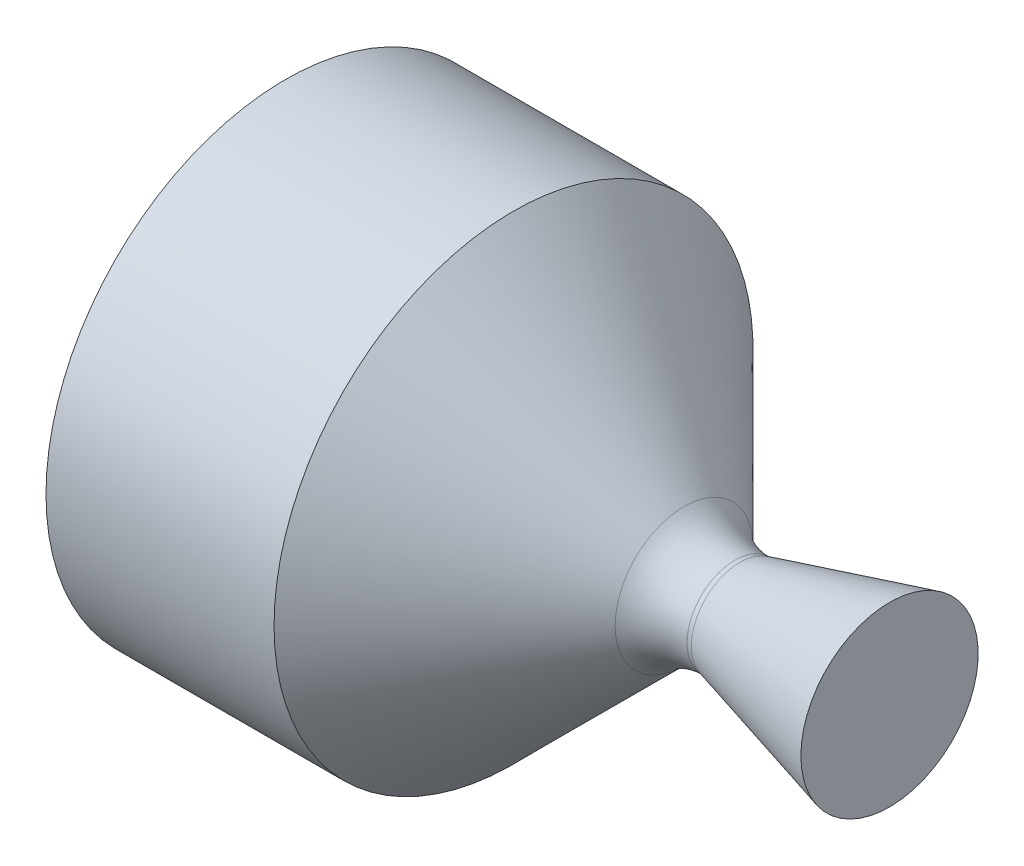
ISO-10303-21;
HEADER;
FILE_DESCRIPTION(('STEP AP214'),'2;1');
FILE_NAME('part.step','',(''),(''),'','','');
FILE_SCHEMA(('AUTOMOTIVE_DESIGN { 1 0 10303 214 1 1 1 1 }'));
ENDSEC;
DATA;
#1=APPLICATION_CONTEXT('core data for automotive mechanical design processes');
#2=APPLICATION_PROTOCOL_DEFINITION('international standard','automotive_design',2000,#1);
#3=PRODUCT_CONTEXT('',#1,'mechanical');
#4=PRODUCT('Part','Part','',(#3));
#5=PRODUCT_RELATED_PRODUCT_CATEGORY('part','',(#4));
#6=PRODUCT_DEFINITION_FORMATION('','',#4);
#7=PRODUCT_DEFINITION_CONTEXT('part definition',#1,'design');
#8=PRODUCT_DEFINITION('design','',#6,#7);
#9=PRODUCT_DEFINITION_SHAPE('','',#8);
#10=(LENGTH_UNIT() NAMED_UNIT(*) SI_UNIT(.MILLI.,.METRE.));
#11=(NAMED_UNIT(*) PLANE_ANGLE_UNIT() SI_UNIT($,.RADIAN.));
#12=(NAMED_UNIT(*) SI_UNIT($,.STERADIAN.) SOLID_ANGLE_UNIT());
#13=UNCERTAINTY_MEASURE_WITH_UNIT(LENGTH_MEASURE(1.E-05),#10,'distance_accuracy_value','');
#14=(GEOMETRIC_REPRESENTATION_CONTEXT(3) GLOBAL_UNCERTAINTY_ASSIGNED_CONTEXT((#13)) GLOBAL_UNIT_ASSIGNED_CONTEXT((#10,
#11,#12)) REPRESENTATION_CONTEXT('',''));
#15=CARTESIAN_POINT('',(0.,0.,0.));
#16=DIRECTION('',(0.,0.,1.));
#17=DIRECTION('',(1.,0.,0.));
#18=AXIS2_PLACEMENT_3D('',#15,#16,#17);
#19=CARTESIAN_POINT('',(-13.36065,28.0607,0.));
#20=DIRECTION('',(1.,0.,0.));
#21=DIRECTION('',(0.,0.,-1.));
#22=AXIS2_PLACEMENT_3D('',#19,#20,#21);
#23=PLANE('',#22);
#24=CARTESIAN_POINT('',(-13.36065,0.,0.));
#25=DIRECTION('',(-1.,0.,0.));
#26=DIRECTION('',(0.,0.,1.));
#27=AXIS2_PLACEMENT_3D('',#24,#25,#26);
#28=CIRCLE('',#27,28.0607);
#29=CARTESIAN_POINT('',(-13.36065,0.,28.0607));
#30=VERTEX_POINT('',#29);
#31=EDGE_CURVE('E61',#30,#30,#28,.T.);
#32=ORIENTED_EDGE('',*,*,#31,.T.);
#33=EDGE_LOOP('',(#32));
#34=FACE_BOUND('',#33,.T.);
#35=ADVANCED_FACE('F39',(#34),#23,.F.);
#36=CARTESIAN_POINT('',(57.4196308633517,10.3864,0.));
#37=DIRECTION('',(-1.,0.,0.));
#38=DIRECTION('',(0.,0.,1.));
#39=AXIS2_PLACEMENT_3D('',#36,#37,#38);
#40=PLANE('',#39);
#41=CARTESIAN_POINT('',(57.4196308633517,0.,0.));
#42=DIRECTION('',(-1.,0.,0.));
#43=DIRECTION('',(0.,0.,1.));
#44=AXIS2_PLACEMENT_3D('',#41,#42,#43);
#45=CIRCLE('',#44,10.3864);
#46=CARTESIAN_POINT('',(57.4196308633517,0.,10.3864));
#47=VERTEX_POINT('',#46);
#48=EDGE_CURVE('E10',#47,#47,#45,.T.);
#49=ORIENTED_EDGE('',*,*,#48,.F.);
#50=EDGE_LOOP('',(#49));
#51=FACE_BOUND('',#50,.T.);
#52=ADVANCED_FACE('F99',(#51),#40,.F.);
#53=CARTESIAN_POINT('',(57.4196308633517,0.,0.));
#54=DIRECTION('',(1.,0.,0.));
#55=DIRECTION('',(0.,0.,-1.));
#56=AXIS2_PLACEMENT_3D('',#53,#54,#55);
#57=CONICAL_SURFACE('',#56,10.3864,0.26179938779915);
#58=CARTESIAN_POINT('',(39.8871692452996,0.,0.));
#59=DIRECTION('',(-1.,0.,0.));
#60=DIRECTION('',(0.,0.,1.));
#61=AXIS2_PLACEMENT_3D('',#58,#59,#60);
#62=CIRCLE('',#61,5.68859106811325);
#63=CARTESIAN_POINT('',(39.8871692452996,0.,5.68859106811325));
#64=VERTEX_POINT('',#63);
#65=EDGE_CURVE('E44',#64,#64,#62,.T.);
#66=ORIENTED_EDGE('',*,*,#65,.F.);
#67=EDGE_LOOP('',(#66));
#68=FACE_BOUND('',#67,.T.);
#69=ORIENTED_EDGE('',*,*,#48,.T.);
#70=EDGE_LOOP('',(#69));
#71=FACE_BOUND('',#70,.T.);
#72=ADVANCED_FACE('F92',(#68,#71),#57,.T.);
#73=CARTESIAN_POINT('',(39.3061619000916,0.,0.));
#74=DIRECTION('',(-1.,0.,0.));
#75=DIRECTION('',(0.,0.,1.));
#76=AXIS2_PLACEMENT_3D('',#73,#74,#75);
#77=TOROIDAL_SURFACE('',#76,7.85694,2.24484);
#78=CARTESIAN_POINT('',(39.3061619000916,0.,0.));
#79=DIRECTION('',(-1.,0.,0.));
#80=DIRECTION('',(0.,0.,1.));
#81=AXIS2_PLACEMENT_3D('',#78,#79,#80);
#82=CIRCLE('',#81,5.6121);
#83=CARTESIAN_POINT('',(39.3061619000916,0.,5.6121));
#84=VERTEX_POINT('',#83);
#85=EDGE_CURVE('E47',#84,#84,#82,.T.);
#86=ORIENTED_EDGE('',*,*,#85,.F.);
#87=EDGE_LOOP('',(#86));
#88=FACE_BOUND('',#87,.T.);
#89=ORIENTED_EDGE('',*,*,#65,.T.);
#90=EDGE_LOOP('',(#89));
#91=FACE_BOUND('',#90,.T.);
#92=ADVANCED_FACE('F89',(#88,#91),#77,.F.);
#93=CARTESIAN_POINT('',(0.,0.,0.));
#94=DIRECTION('',(-1.,0.,0.));
#95=DIRECTION('',(0.,0.,1.));
#96=AXIS2_PLACEMENT_3D('',#93,#94,#95);
#97=CYLINDRICAL_SURFACE('',#96,5.6121);
#98=CARTESIAN_POINT('',(39.2961619000916,0.,0.));
#99=DIRECTION('',(-1.,0.,0.));
#100=DIRECTION('',(0.,0.,1.));
#101=AXIS2_PLACEMENT_3D('',#98,#99,#100);
#102=CIRCLE('',#101,5.6121);
#103=CARTESIAN_POINT('',(39.2961619000916,0.,5.6121));
#104=VERTEX_POINT('',#103);
#105=EDGE_CURVE('E52',#104,#104,#102,.T.);
#106=ORIENTED_EDGE('',*,*,#105,.F.);
#107=EDGE_LOOP('',(#106));
#108=FACE_BOUND('',#107,.T.);
#109=ORIENTED_EDGE('',*,*,#85,.T.);
#110=EDGE_LOOP('',(#109));
#111=FACE_BOUND('',#110,.T.);
#112=ADVANCED_FACE('F85',(#108,#111),#97,.T.);
#113=CARTESIAN_POINT('',(39.2961619000916,0.,0.));
#114=DIRECTION('',(-1.,0.,0.));
#115=DIRECTION('',(0.,0.,1.));
#116=AXIS2_PLACEMENT_3D('',#113,#114,#115);
#117=TOROIDAL_SURFACE('',#116,14.03025,8.41815);
#118=CARTESIAN_POINT('',(33.3436309500461,0.,0.));
#119=DIRECTION('',(-1.,0.,0.));
#120=DIRECTION('',(0.,0.,1.));
#121=AXIS2_PLACEMENT_3D('',#118,#119,#120);
#122=CIRCLE('',#121,8.07771904995439);
#123=CARTESIAN_POINT('',(33.3436309500461,0.,8.07771904995439));
#124=VERTEX_POINT('',#123);
#125=EDGE_CURVE('E59',#124,#124,#122,.T.);
#126=ORIENTED_EDGE('',*,*,#125,.F.);
#127=EDGE_LOOP('',(#126));
#128=FACE_BOUND('',#127,.T.);
#129=ORIENTED_EDGE('',*,*,#105,.T.);
#130=EDGE_LOOP('',(#129));
#131=FACE_BOUND('',#130,.T.);
#132=ADVANCED_FACE('F79',(#128,#131),#117,.F.);
#133=CARTESIAN_POINT('',(33.3436309500461,0.,0.));
#134=DIRECTION('',(-1.,0.,0.));
#135=DIRECTION('',(0.,0.,1.));
#136=AXIS2_PLACEMENT_3D('',#133,#134,#135);
#137=CONICAL_SURFACE('',#136,8.07771904995439,0.785398163397436);
#138=CARTESIAN_POINT('',(13.36065,0.,0.));
#139=DIRECTION('',(-1.,0.,0.));
#140=DIRECTION('',(0.,0.,1.));
#141=AXIS2_PLACEMENT_3D('',#138,#139,#140);
#142=CIRCLE('',#141,28.0607);
#143=CARTESIAN_POINT('',(13.36065,0.,28.0607));
#144=VERTEX_POINT('',#143);
#145=EDGE_CURVE('E62',#144,#144,#142,.T.);
#146=CARTESIAN_POINT('',(13.36065,0.,28.0607));
#147=CARTESIAN_POINT('',(13.568806051563,0.,27.852543948437));
#148=CARTESIAN_POINT('',(13.776962103126,0.,27.6443878968741));
#149=CARTESIAN_POINT('',(14.1932742062519,0.,27.2280757937481));
#150=CARTESIAN_POINT('',(14.4014302578149,0.,27.0199197421851));
#151=CARTESIAN_POINT('',(14.8177423609409,0.,26.6036076390592));
#152=CARTESIAN_POINT('',(15.0258984125038,0.,26.3954515874962));
#153=CARTESIAN_POINT('',(15.4422105156298,0.,25.9791394843703));
#154=CARTESIAN_POINT('',(15.6503665671928,0.,25.7709834328073));
#155=CARTESIAN_POINT('',(16.0666786703187,0.,25.3546713296813));
#156=CARTESIAN_POINT('',(16.2748347218817,0.,25.1465152781184));
#157=CARTESIAN_POINT('',(16.6911468250077,0.,24.7302031749924));
#158=CARTESIAN_POINT('',(16.8993028765707,0.,24.5220471234294));
#159=CARTESIAN_POINT('',(17.3156149796966,0.,24.1057350203035));
#160=CARTESIAN_POINT('',(17.5237710312596,0.,23.8975789687405));
#161=CARTESIAN_POINT('',(17.9400831343856,0.,23.4812668656146));
#162=CARTESIAN_POINT('',(18.1482391859485,0.,23.2731108140516));
#163=CARTESIAN_POINT('',(18.5645512890745,0.,22.8567987109256));
#164=CARTESIAN_POINT('',(18.7727073406375,0.,22.6486426593626));
#165=CARTESIAN_POINT('',(19.1890194437634,0.,22.2323305562367));
#166=CARTESIAN_POINT('',(19.3971754953264,0.,22.0241745046737));
#167=CARTESIAN_POINT('',(19.8134875984524,0.,21.6078624015478));
#168=CARTESIAN_POINT('',(20.0216436500154,0.,21.3997063499848));
#169=CARTESIAN_POINT('',(20.4379557531413,0.,20.9833942468589));
#170=CARTESIAN_POINT('',(20.6461118047043,0.,20.7752381952959));
#171=CARTESIAN_POINT('',(21.0624239078303,0.,20.3589260921699));
#172=CARTESIAN_POINT('',(21.2705799593932,0.,20.150770040607));
#173=CARTESIAN_POINT('',(21.6868920625192,0.,19.734457937481));
#174=CARTESIAN_POINT('',(21.8950481140822,0.,19.526301885918));
#175=CARTESIAN_POINT('',(22.3113602172081,0.,19.1099897827921));
#176=CARTESIAN_POINT('',(22.5195162687711,0.,18.9018337312291));
#177=CARTESIAN_POINT('',(22.9358283718971,0.,18.4855216281031));
#178=CARTESIAN_POINT('',(23.1439844234601,0.,18.2773655765402));
#179=CARTESIAN_POINT('',(23.560296526586,0.,17.8610534734142));
#180=CARTESIAN_POINT('',(23.768452578149,0.,17.6528974218512));
#181=CARTESIAN_POINT('',(24.184764681275,0.,17.2365853187253));
#182=CARTESIAN_POINT('',(24.3929207328379,0.,17.0284292671623));
#183=CARTESIAN_POINT('',(24.8092328359639,0.,16.6121171640364));
#184=CARTESIAN_POINT('',(25.0173888875269,0.,16.4039611124734));
#185=CARTESIAN_POINT('',(25.4337009906529,0.,15.9876490093475));
#186=CARTESIAN_POINT('',(25.6418570422158,0.,15.7794929577845));
#187=CARTESIAN_POINT('',(26.0581691453418,0.,15.3631808546585));
#188=CARTESIAN_POINT('',(26.2663251969048,0.,15.1550248030955));
#189=CARTESIAN_POINT('',(26.6826373000307,0.,14.7387126999696));
#190=CARTESIAN_POINT('',(26.8907933515937,0.,14.5305566484066));
#191=CARTESIAN_POINT('',(27.3071054547197,0.,14.1142445452807));
#192=CARTESIAN_POINT('',(27.5152615062827,0.,13.9060884937177));
#193=CARTESIAN_POINT('',(27.9315736094086,0.,13.4897763905917));
#194=CARTESIAN_POINT('',(28.1397296609716,0.,13.2816203390288));
#195=CARTESIAN_POINT('',(28.5560417640976,0.,12.8653082359028));
#196=CARTESIAN_POINT('',(28.7641978156605,0.,12.6571521843398));
#197=CARTESIAN_POINT('',(29.1805099187865,0.,12.2408400812139));
#198=CARTESIAN_POINT('',(29.3886659703495,0.,12.0326840296509));
#199=CARTESIAN_POINT('',(29.8049780734754,0.,11.616371926525));
#200=CARTESIAN_POINT('',(30.0131341250384,0.,11.408215874962));
#201=CARTESIAN_POINT('',(30.4294462281644,0.,10.991903771836));
#202=CARTESIAN_POINT('',(30.6376022797274,0.,10.7837477202731));
#203=CARTESIAN_POINT('',(31.0539143828533,0.,10.3674356171471));
#204=CARTESIAN_POINT('',(31.2620704344163,0.,10.1592795655841));
#205=CARTESIAN_POINT('',(31.6783825375423,0.,9.74296746245819));
#206=CARTESIAN_POINT('',(31.8865385891052,0.,9.53481141089522));
#207=CARTESIAN_POINT('',(32.3028506922312,0.,9.11849930776927));
#208=CARTESIAN_POINT('',(32.5110067437942,0.,8.91034325620629));
#209=CARTESIAN_POINT('',(32.9273188469201,0.,8.49403115308034));
#210=CARTESIAN_POINT('',(33.1354748984831,0.,8.28587510151737));
#211=CARTESIAN_POINT('',(33.3436309500461,0.,8.07771904995439));
#212=B_SPLINE_CURVE_WITH_KNOTS('',3,(#146,#147,#148,#149,#150,#151,#152,#153,#154,#155,#156,
#157,#158,#159,#160,#161,#162,#163,#164,#165,#166,#167,#168,#169,#170,#171,#172,#173,#174,#175,
#176,#177,#178,#179,#180,#181,#182,#183,#184,#185,#186,#187,#188,#189,#190,#191,#192,#193,#194,
#195,#196,#197,#198,#199,#200,#201,#202,#203,#204,#205,#206,#207,#208,#209,#210,#211),
.UNSPECIFIED.,.F.,.F.,(4,2,2,2,2,2,2,2,2,2,2,2,2,2,2,2,2,2,2,2,2,2,2,2,2,2,2,2,2,2,2,2,4),(0.,
0.883131333631191,1.76626266726238,2.64939400089357,3.53252533452475,4.41565666815595,
5.29878800178713,6.18191933541832,7.06505066904951,7.9481820026807,8.83131333631189,
9.71444466994308,10.5975760035743,11.4807073372055,12.3638386708366,13.2469700044678,
14.130101338099,15.0132326717302,15.8963640053614,16.7794953389926,17.6626266726238,
18.545758006255,19.4288893398862,20.3120206735173,21.1951520071485,22.0782833407797,
22.9614146744109,23.8445460080421,24.7276773416733,25.6108086753045,26.4939400089357,
27.3770713425669,28.260202676198),.UNSPECIFIED.);
#213=EDGE_CURVE('BSEAM75',#144,#124,#212,.T.);
#214=ORIENTED_EDGE('',*,*,#145,.F.);
#215=ORIENTED_EDGE('',*,*,#125,.T.);
#216=ORIENTED_EDGE('',*,*,#213,.T.);
#217=ORIENTED_EDGE('',*,*,#213,.F.);
#218=EDGE_LOOP('',(#214,#216,#215,#217));
#219=FACE_BOUND('',#218,.T.);
#220=ADVANCED_FACE('F75',(#219),#137,.T.);
#221=CARTESIAN_POINT('',(0.,0.,0.));
#222=DIRECTION('',(-1.,0.,0.));
#223=DIRECTION('',(0.,0.,1.));
#224=AXIS2_PLACEMENT_3D('',#221,#222,#223);
#225=CYLINDRICAL_SURFACE('',#224,28.0607);
#226=ORIENTED_EDGE('',*,*,#31,.F.);
#227=EDGE_LOOP('',(#226));
#228=FACE_BOUND('',#227,.T.);
#229=ORIENTED_EDGE('',*,*,#145,.T.);
#230=EDGE_LOOP('',(#229));
#231=FACE_BOUND('',#230,.T.);
#232=ADVANCED_FACE('F70',(#228,#231),#225,.T.);
#233=CLOSED_SHELL('',(#35,#52,#72,#92,#112,#132,#220,#232));
#234=MANIFOLD_SOLID_BREP('B2',#233);
#235=ADVANCED_BREP_SHAPE_REPRESENTATION('',(#18,#234),#14);
#236=SHAPE_DEFINITION_REPRESENTATION(#9,#235);
ENDSEC;
END-ISO-10303-21;
